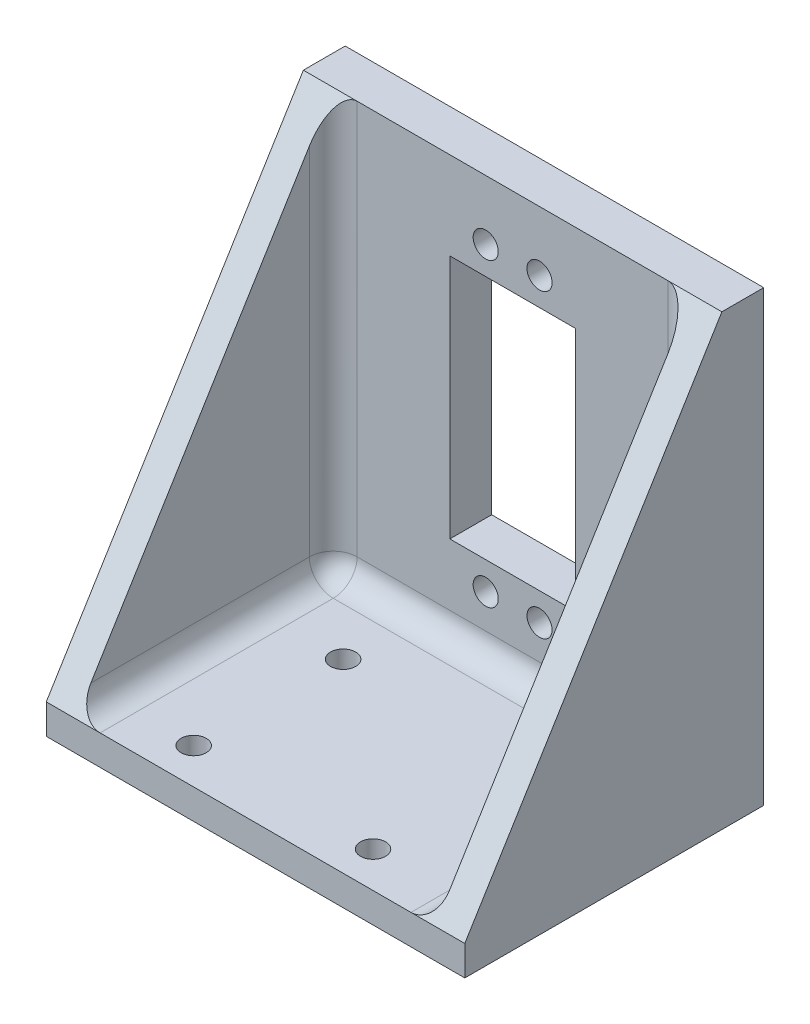
ISO-10303-21;
HEADER;
FILE_DESCRIPTION(('STEP AP214'),'2;1');
FILE_NAME('part.step','',(''),(''),'','','');
FILE_SCHEMA(('AUTOMOTIVE_DESIGN { 1 0 10303 214 1 1 1 1 }'));
ENDSEC;
DATA;
#1=APPLICATION_CONTEXT('core data for automotive mechanical design processes');
#2=APPLICATION_PROTOCOL_DEFINITION('international standard','automotive_design',2000,#1);
#3=PRODUCT_CONTEXT('',#1,'mechanical');
#4=PRODUCT('Part','Part','',(#3));
#5=PRODUCT_RELATED_PRODUCT_CATEGORY('part','',(#4));
#6=PRODUCT_DEFINITION_FORMATION('','',#4);
#7=PRODUCT_DEFINITION_CONTEXT('part definition',#1,'design');
#8=PRODUCT_DEFINITION('design','',#6,#7);
#9=PRODUCT_DEFINITION_SHAPE('','',#8);
#10=(LENGTH_UNIT() NAMED_UNIT(*) SI_UNIT(.MILLI.,.METRE.));
#11=(NAMED_UNIT(*) PLANE_ANGLE_UNIT() SI_UNIT($,.RADIAN.));
#12=(NAMED_UNIT(*) SI_UNIT($,.STERADIAN.) SOLID_ANGLE_UNIT());
#13=UNCERTAINTY_MEASURE_WITH_UNIT(LENGTH_MEASURE(1.E-05),#10,'distance_accuracy_value','');
#14=(GEOMETRIC_REPRESENTATION_CONTEXT(3) GLOBAL_UNCERTAINTY_ASSIGNED_CONTEXT((#13)) GLOBAL_UNIT_ASSIGNED_CONTEXT((#10,
#11,#12)) REPRESENTATION_CONTEXT('',''));
#15=CARTESIAN_POINT('',(0.,0.,0.));
#16=DIRECTION('',(0.,0.,1.));
#17=DIRECTION('',(1.,0.,0.));
#18=AXIS2_PLACEMENT_3D('',#15,#16,#17);
#19=CARTESIAN_POINT('',(0.,5.,0.));
#20=DIRECTION('',(0.,-1.,0.));
#21=DIRECTION('',(0.,0.,-1.));
#22=AXIS2_PLACEMENT_3D('',#19,#20,#21);
#23=PLANE('',#22);
#24=CARTESIAN_POINT('',(13.6520372940353,5.,-6.));
#25=DIRECTION('',(0.,1.,0.));
#26=DIRECTION('',(0.,0.,1.));
#27=AXIS2_PLACEMENT_3D('',#24,#25,#26);
#28=CIRCLE('',#27,2.1);
#29=CARTESIAN_POINT('',(13.6520372940353,5.,-3.9));
#30=VERTEX_POINT('',#29);
#31=EDGE_CURVE('E534',#30,#30,#28,.T.);
#32=ORIENTED_EDGE('',*,*,#31,.F.);
#33=EDGE_LOOP('',(#32));
#34=FACE_BOUND('',#33,.T.);
#35=CARTESIAN_POINT('',(-16.3479627059647,5.,19.));
#36=DIRECTION('',(0.,1.,0.));
#37=DIRECTION('',(0.,0.,1.));
#38=AXIS2_PLACEMENT_3D('',#35,#36,#37);
#39=CIRCLE('',#38,2.1);
#40=CARTESIAN_POINT('',(-16.3479627059647,5.,21.1));
#41=VERTEX_POINT('',#40);
#42=EDGE_CURVE('E530',#41,#41,#39,.T.);
#43=ORIENTED_EDGE('',*,*,#42,.F.);
#44=EDGE_LOOP('',(#43));
#45=FACE_BOUND('',#44,.T.);
#46=CARTESIAN_POINT('',(13.6520372940353,5.,19.));
#47=DIRECTION('',(0.,1.,0.));
#48=DIRECTION('',(0.,0.,1.));
#49=AXIS2_PLACEMENT_3D('',#46,#47,#48);
#50=CIRCLE('',#49,2.1);
#51=CARTESIAN_POINT('',(13.6520372940353,5.,21.1));
#52=VERTEX_POINT('',#51);
#53=EDGE_CURVE('E522',#52,#52,#50,.T.);
#54=ORIENTED_EDGE('',*,*,#53,.F.);
#55=EDGE_LOOP('',(#54));
#56=FACE_BOUND('',#55,.T.);
#57=CARTESIAN_POINT('',(-16.3479627059647,5.,-6.));
#58=DIRECTION('',(0.,1.,0.));
#59=DIRECTION('',(0.,0.,1.));
#60=AXIS2_PLACEMENT_3D('',#57,#58,#59);
#61=CIRCLE('',#60,2.1);
#62=CARTESIAN_POINT('',(-16.3479627059647,5.,-3.9));
#63=VERTEX_POINT('',#62);
#64=EDGE_CURVE('E325',#63,#63,#61,.T.);
#65=ORIENTED_EDGE('',*,*,#64,.F.);
#66=EDGE_LOOP('',(#65));
#67=FACE_BOUND('',#66,.T.);
#68=DIRECTION('',(1.,0.,0.));
#69=VECTOR('',#68,1.);
#70=CARTESIAN_POINT('',(-30.,5.,-14.));
#71=LINE('',#70,#69);
#72=CARTESIAN_POINT('',(26.,5.,-14.));
#73=VERTEX_POINT('',#72);
#74=CARTESIAN_POINT('',(-26.,5.,-14.));
#75=VERTEX_POINT('',#74);
#76=EDGE_CURVE('E248',#73,#75,#71,.F.);
#77=ORIENTED_EDGE('',*,*,#76,.T.);
#78=DIRECTION('',(0.,0.,1.));
#79=VECTOR('',#78,1.);
#80=CARTESIAN_POINT('',(-26.,5.,25.));
#81=LINE('',#80,#79);
#82=CARTESIAN_POINT('',(-26.,5.,25.));
#83=VERTEX_POINT('',#82);
#84=EDGE_CURVE('E256',#75,#83,#81,.T.);
#85=ORIENTED_EDGE('',*,*,#84,.T.);
#86=DIRECTION('',(1.,0.,0.));
#87=VECTOR('',#86,1.);
#88=CARTESIAN_POINT('',(-35.,5.,25.));
#89=LINE('',#88,#87);
#90=CARTESIAN_POINT('',(26.,5.,25.));
#91=VERTEX_POINT('',#90);
#92=EDGE_CURVE('E198',#83,#91,#89,.T.);
#93=ORIENTED_EDGE('',*,*,#92,.T.);
#94=DIRECTION('',(0.,0.,-1.));
#95=VECTOR('',#94,1.);
#96=CARTESIAN_POINT('',(26.,5.,0.));
#97=LINE('',#96,#95);
#98=EDGE_CURVE('E252',#91,#73,#97,.T.);
#99=ORIENTED_EDGE('',*,*,#98,.T.);
#100=EDGE_LOOP('',(#77,#85,#93,#99));
#101=FACE_BOUND('',#100,.T.);
#102=ADVANCED_FACE('F45',(#34,#45,#56,#67,#101),#23,.F.);
#103=CARTESIAN_POINT('',(-35.,75.,-18.));
#104=DIRECTION('',(0.,0.,-1.));
#105=DIRECTION('',(-1.,0.,0.));
#106=AXIS2_PLACEMENT_3D('',#103,#104,#105);
#107=PLANE('',#106);
#108=CARTESIAN_POINT('',(4.5,65.,-18.));
#109=DIRECTION('',(0.,0.,-1.));
#110=DIRECTION('',(-1.,0.,0.));
#111=AXIS2_PLACEMENT_3D('',#108,#109,#110);
#112=CIRCLE('',#111,2.10000000000001);
#113=CARTESIAN_POINT('',(2.4,65.,-18.));
#114=VERTEX_POINT('',#113);
#115=EDGE_CURVE('E211',#114,#114,#112,.T.);
#116=ORIENTED_EDGE('',*,*,#115,.T.);
#117=EDGE_LOOP('',(#116));
#118=FACE_BOUND('',#117,.T.);
#119=CARTESIAN_POINT('',(-4.50000000000001,65.,-18.));
#120=DIRECTION('',(0.,0.,-1.));
#121=DIRECTION('',(-1.,0.,0.));
#122=AXIS2_PLACEMENT_3D('',#119,#120,#121);
#123=CIRCLE('',#122,2.10000000000001);
#124=CARTESIAN_POINT('',(-6.60000000000001,65.,-18.));
#125=VERTEX_POINT('',#124);
#126=EDGE_CURVE('E215',#125,#125,#123,.T.);
#127=ORIENTED_EDGE('',*,*,#126,.T.);
#128=EDGE_LOOP('',(#127));
#129=FACE_BOUND('',#128,.T.);
#130=DIRECTION('',(0.,-1.,0.));
#131=VECTOR('',#130,1.);
#132=CARTESIAN_POINT('',(10.5,75.,-18.));
#133=LINE('',#132,#131);
#134=CARTESIAN_POINT('',(10.5,60.35,-18.));
#135=VERTEX_POINT('',#134);
#136=CARTESIAN_POINT('',(10.5,19.35,-18.));
#137=VERTEX_POINT('',#136);
#138=EDGE_CURVE('E228',#135,#137,#133,.T.);
#139=ORIENTED_EDGE('',*,*,#138,.T.);
#140=DIRECTION('',(-1.,0.,0.));
#141=VECTOR('',#140,1.);
#142=CARTESIAN_POINT('',(-35.,19.35,-18.));
#143=LINE('',#142,#141);
#144=CARTESIAN_POINT('',(-10.5,19.35,-18.));
#145=VERTEX_POINT('',#144);
#146=EDGE_CURVE('E232',#137,#145,#143,.T.);
#147=ORIENTED_EDGE('',*,*,#146,.T.);
#148=DIRECTION('',(0.,1.,0.));
#149=VECTOR('',#148,1.);
#150=CARTESIAN_POINT('',(-10.5,75.,-18.));
#151=LINE('',#150,#149);
#152=CARTESIAN_POINT('',(-10.5,60.35,-18.));
#153=VERTEX_POINT('',#152);
#154=EDGE_CURVE('E210',#145,#153,#151,.T.);
#155=ORIENTED_EDGE('',*,*,#154,.T.);
#156=DIRECTION('',(1.,0.,0.));
#157=VECTOR('',#156,1.);
#158=CARTESIAN_POINT('',(-35.,60.35,-18.));
#159=LINE('',#158,#157);
#160=EDGE_CURVE('E224',#153,#135,#159,.T.);
#161=ORIENTED_EDGE('',*,*,#160,.T.);
#162=EDGE_LOOP('',(#139,#147,#155,#161));
#163=FACE_BOUND('',#162,.T.);
#164=CARTESIAN_POINT('',(-4.50000000000001,14.7,-18.));
#165=DIRECTION('',(0.,0.,-1.));
#166=DIRECTION('',(-1.,0.,0.));
#167=AXIS2_PLACEMENT_3D('',#164,#165,#166);
#168=CIRCLE('',#167,2.1);
#169=CARTESIAN_POINT('',(-6.60000000000001,14.7,-18.));
#170=VERTEX_POINT('',#169);
#171=EDGE_CURVE('E220',#170,#170,#168,.T.);
#172=ORIENTED_EDGE('',*,*,#171,.T.);
#173=EDGE_LOOP('',(#172));
#174=FACE_BOUND('',#173,.T.);
#175=CARTESIAN_POINT('',(4.5,14.7,-18.));
#176=DIRECTION('',(0.,0.,-1.));
#177=DIRECTION('',(-1.,0.,0.));
#178=AXIS2_PLACEMENT_3D('',#175,#176,#177);
#179=CIRCLE('',#178,2.1);
#180=CARTESIAN_POINT('',(2.4,14.7,-18.));
#181=VERTEX_POINT('',#180);
#182=EDGE_CURVE('E240',#181,#181,#179,.T.);
#183=ORIENTED_EDGE('',*,*,#182,.T.);
#184=EDGE_LOOP('',(#183));
#185=FACE_BOUND('',#184,.T.);
#186=DIRECTION('',(1.,0.,0.));
#187=VECTOR('',#186,1.);
#188=CARTESIAN_POINT('',(-35.,75.,-18.));
#189=LINE('',#188,#187);
#190=CARTESIAN_POINT('',(-26.,75.,-18.));
#191=VERTEX_POINT('',#190);
#192=CARTESIAN_POINT('',(26.,75.,-18.));
#193=VERTEX_POINT('',#192);
#194=EDGE_CURVE('E380',#191,#193,#189,.T.);
#195=ORIENTED_EDGE('',*,*,#194,.F.);
#196=DIRECTION('',(0.,-1.,0.));
#197=VECTOR('',#196,1.);
#198=CARTESIAN_POINT('',(-26.,9.00000000000001,-18.));
#199=LINE('',#198,#197);
#200=CARTESIAN_POINT('',(-26.,9.00000000000001,-18.));
#201=VERTEX_POINT('',#200);
#202=EDGE_CURVE('E282',#191,#201,#199,.T.);
#203=ORIENTED_EDGE('',*,*,#202,.T.);
#204=DIRECTION('',(1.,0.,0.));
#205=VECTOR('',#204,1.);
#206=CARTESIAN_POINT('',(30.,9.00000000000001,-18.));
#207=LINE('',#206,#205);
#208=CARTESIAN_POINT('',(26.,9.00000000000001,-18.));
#209=VERTEX_POINT('',#208);
#210=EDGE_CURVE('E236',#201,#209,#207,.T.);
#211=ORIENTED_EDGE('',*,*,#210,.T.);
#212=DIRECTION('',(0.,1.,0.));
#213=VECTOR('',#212,1.);
#214=CARTESIAN_POINT('',(26.,75.,-18.));
#215=LINE('',#214,#213);
#216=EDGE_CURVE('E278',#209,#193,#215,.T.);
#217=ORIENTED_EDGE('',*,*,#216,.T.);
#218=EDGE_LOOP('',(#195,#203,#211,#217));
#219=FACE_BOUND('',#218,.T.);
#220=ADVANCED_FACE('F428',(#118,#129,#163,#174,#185,#219),#107,.F.);
#221=CARTESIAN_POINT('',(35.,5.,25.));
#222=DIRECTION('',(-1.,0.,0.));
#223=DIRECTION('',(0.,0.,1.));
#224=AXIS2_PLACEMENT_3D('',#221,#222,#223);
#225=PLANE('',#224);
#226=DIRECTION('',(0.,0.,-1.));
#227=VECTOR('',#226,1.);
#228=CARTESIAN_POINT('',(35.,0.,25.));
#229=LINE('',#228,#227);
#230=CARTESIAN_POINT('',(35.,0.,25.));
#231=VERTEX_POINT('',#230);
#232=CARTESIAN_POINT('',(35.,0.,-25.));
#233=VERTEX_POINT('',#232);
#234=EDGE_CURVE('E388',#231,#233,#229,.T.);
#235=ORIENTED_EDGE('',*,*,#234,.T.);
#236=DIRECTION('',(0.,-1.,0.));
#237=VECTOR('',#236,1.);
#238=CARTESIAN_POINT('',(35.,5.,-25.));
#239=LINE('',#238,#237);
#240=CARTESIAN_POINT('',(35.,75.,-25.));
#241=VERTEX_POINT('',#240);
#242=EDGE_CURVE('E206',#241,#233,#239,.T.);
#243=ORIENTED_EDGE('',*,*,#242,.F.);
#244=DIRECTION('',(0.,0.,-1.));
#245=VECTOR('',#244,1.);
#246=CARTESIAN_POINT('',(35.,75.,-25.));
#247=LINE('',#246,#245);
#248=CARTESIAN_POINT('',(35.,75.,-18.));
#249=VERTEX_POINT('',#248);
#250=EDGE_CURVE('E181',#249,#241,#247,.T.);
#251=ORIENTED_EDGE('',*,*,#250,.F.);
#252=DIRECTION('',(0.,-0.852075986307815,0.523418105874801));
#253=VECTOR('',#252,1.);
#254=CARTESIAN_POINT('',(35.,75.,-18.));
#255=LINE('',#254,#253);
#256=CARTESIAN_POINT('',(35.,5.,25.));
#257=VERTEX_POINT('',#256);
#258=EDGE_CURVE('E159',#249,#257,#255,.T.);
#259=ORIENTED_EDGE('',*,*,#258,.T.);
#260=DIRECTION('',(0.,-1.,0.));
#261=VECTOR('',#260,1.);
#262=CARTESIAN_POINT('',(35.,5.,25.));
#263=LINE('',#262,#261);
#264=EDGE_CURVE('E178',#257,#231,#263,.T.);
#265=ORIENTED_EDGE('',*,*,#264,.T.);
#266=EDGE_LOOP('',(#235,#243,#251,#259,#265));
#267=FACE_BOUND('',#266,.T.);
#268=ADVANCED_FACE('F177',(#267),#225,.F.);
#269=CARTESIAN_POINT('',(-35.,5.,-25.));
#270=DIRECTION('',(0.,0.,1.));
#271=DIRECTION('',(1.,0.,0.));
#272=AXIS2_PLACEMENT_3D('',#269,#270,#271);
#273=PLANE('',#272);
#274=CARTESIAN_POINT('',(4.5,14.7,-25.));
#275=DIRECTION('',(0.,0.,-1.));
#276=DIRECTION('',(1.,0.,0.));
#277=AXIS2_PLACEMENT_3D('',#274,#275,#276);
#278=CIRCLE('',#277,2.1);
#279=CARTESIAN_POINT('',(6.60000000000001,14.7,-25.));
#280=VERTEX_POINT('',#279);
#281=EDGE_CURVE('E332',#280,#280,#278,.T.);
#282=ORIENTED_EDGE('',*,*,#281,.F.);
#283=EDGE_LOOP('',(#282));
#284=FACE_BOUND('',#283,.T.);
#285=CARTESIAN_POINT('',(-4.50000000000001,14.7,-25.));
#286=DIRECTION('',(0.,0.,-1.));
#287=DIRECTION('',(-1.,0.,0.));
#288=AXIS2_PLACEMENT_3D('',#285,#286,#287);
#289=CIRCLE('',#288,2.1);
#290=CARTESIAN_POINT('',(-6.60000000000001,14.7,-25.));
#291=VERTEX_POINT('',#290);
#292=EDGE_CURVE('E355',#291,#291,#289,.T.);
#293=ORIENTED_EDGE('',*,*,#292,.F.);
#294=EDGE_LOOP('',(#293));
#295=FACE_BOUND('',#294,.T.);
#296=DIRECTION('',(0.,1.,0.));
#297=VECTOR('',#296,1.);
#298=CARTESIAN_POINT('',(-10.5,19.35,-25.));
#299=LINE('',#298,#297);
#300=CARTESIAN_POINT('',(-10.5,19.35,-25.));
#301=VERTEX_POINT('',#300);
#302=CARTESIAN_POINT('',(-10.5,60.35,-25.));
#303=VERTEX_POINT('',#302);
#304=EDGE_CURVE('E363',#301,#303,#299,.T.);
#305=ORIENTED_EDGE('',*,*,#304,.F.);
#306=DIRECTION('',(-1.,0.,0.));
#307=VECTOR('',#306,1.);
#308=CARTESIAN_POINT('',(10.5,19.35,-25.));
#309=LINE('',#308,#307);
#310=CARTESIAN_POINT('',(10.5,19.35,-25.));
#311=VERTEX_POINT('',#310);
#312=EDGE_CURVE('E340',#311,#301,#309,.T.);
#313=ORIENTED_EDGE('',*,*,#312,.F.);
#314=DIRECTION('',(0.,-1.,0.));
#315=VECTOR('',#314,1.);
#316=CARTESIAN_POINT('',(10.5,19.35,-25.));
#317=LINE('',#316,#315);
#318=CARTESIAN_POINT('',(10.5,60.35,-25.));
#319=VERTEX_POINT('',#318);
#320=EDGE_CURVE('E345',#319,#311,#317,.T.);
#321=ORIENTED_EDGE('',*,*,#320,.F.);
#322=DIRECTION('',(1.,0.,0.));
#323=VECTOR('',#322,1.);
#324=CARTESIAN_POINT('',(10.5,60.35,-25.));
#325=LINE('',#324,#323);
#326=EDGE_CURVE('E359',#303,#319,#325,.T.);
#327=ORIENTED_EDGE('',*,*,#326,.F.);
#328=EDGE_LOOP('',(#305,#313,#321,#327));
#329=FACE_BOUND('',#328,.T.);
#330=CARTESIAN_POINT('',(-4.50000000000001,65.,-25.));
#331=DIRECTION('',(0.,0.,-1.));
#332=DIRECTION('',(1.,0.,0.));
#333=AXIS2_PLACEMENT_3D('',#330,#331,#332);
#334=CIRCLE('',#333,2.10000000000001);
#335=CARTESIAN_POINT('',(-2.4,65.,-25.));
#336=VERTEX_POINT('',#335);
#337=EDGE_CURVE('E336',#336,#336,#334,.T.);
#338=ORIENTED_EDGE('',*,*,#337,.F.);
#339=EDGE_LOOP('',(#338));
#340=FACE_BOUND('',#339,.T.);
#341=CARTESIAN_POINT('',(4.5,65.,-25.));
#342=DIRECTION('',(0.,0.,-1.));
#343=DIRECTION('',(-1.,0.,0.));
#344=AXIS2_PLACEMENT_3D('',#341,#342,#343);
#345=CIRCLE('',#344,2.10000000000001);
#346=CARTESIAN_POINT('',(2.4,65.,-25.));
#347=VERTEX_POINT('',#346);
#348=EDGE_CURVE('E216',#347,#347,#345,.T.);
#349=ORIENTED_EDGE('',*,*,#348,.F.);
#350=EDGE_LOOP('',(#349));
#351=FACE_BOUND('',#350,.T.);
#352=DIRECTION('',(-1.,0.,0.));
#353=VECTOR('',#352,1.);
#354=CARTESIAN_POINT('',(-35.,0.,-25.));
#355=LINE('',#354,#353);
#356=CARTESIAN_POINT('',(-35.,0.,-25.));
#357=VERTEX_POINT('',#356);
#358=EDGE_CURVE('E392',#233,#357,#355,.T.);
#359=ORIENTED_EDGE('',*,*,#358,.T.);
#360=DIRECTION('',(0.,-1.,0.));
#361=VECTOR('',#360,1.);
#362=CARTESIAN_POINT('',(-35.,5.,-25.));
#363=LINE('',#362,#361);
#364=CARTESIAN_POINT('',(-35.,75.,-25.));
#365=VERTEX_POINT('',#364);
#366=EDGE_CURVE('E196',#365,#357,#363,.T.);
#367=ORIENTED_EDGE('',*,*,#366,.F.);
#368=DIRECTION('',(-1.,0.,0.));
#369=VECTOR('',#368,1.);
#370=CARTESIAN_POINT('',(-35.,75.,-25.));
#371=LINE('',#370,#369);
#372=EDGE_CURVE('E385',#241,#365,#371,.T.);
#373=ORIENTED_EDGE('',*,*,#372,.F.);
#374=ORIENTED_EDGE('',*,*,#242,.T.);
#375=EDGE_LOOP('',(#359,#367,#373,#374));
#376=FACE_BOUND('',#375,.T.);
#377=ADVANCED_FACE('F435',(#284,#295,#329,#340,#351,#376),#273,.F.);
#378=CARTESIAN_POINT('',(-35.,5.,25.));
#379=DIRECTION('',(1.,0.,0.));
#380=DIRECTION('',(0.,0.,-1.));
#381=AXIS2_PLACEMENT_3D('',#378,#379,#380);
#382=PLANE('',#381);
#383=DIRECTION('',(0.,-1.,0.));
#384=VECTOR('',#383,1.);
#385=CARTESIAN_POINT('',(-35.,5.,25.));
#386=LINE('',#385,#384);
#387=CARTESIAN_POINT('',(-35.,5.,25.));
#388=VERTEX_POINT('',#387);
#389=CARTESIAN_POINT('',(-35.,0.,25.));
#390=VERTEX_POINT('',#389);
#391=EDGE_CURVE('E191',#388,#390,#386,.T.);
#392=ORIENTED_EDGE('',*,*,#391,.F.);
#393=DIRECTION('',(0.,0.852075986307815,-0.523418105874801));
#394=VECTOR('',#393,1.);
#395=CARTESIAN_POINT('',(-35.,75.,-18.));
#396=LINE('',#395,#394);
#397=CARTESIAN_POINT('',(-35.,75.,-18.));
#398=VERTEX_POINT('',#397);
#399=EDGE_CURVE('E170',#388,#398,#396,.T.);
#400=ORIENTED_EDGE('',*,*,#399,.T.);
#401=DIRECTION('',(0.,0.,1.));
#402=VECTOR('',#401,1.);
#403=CARTESIAN_POINT('',(-35.,75.,-25.));
#404=LINE('',#403,#402);
#405=EDGE_CURVE('E244',#365,#398,#404,.T.);
#406=ORIENTED_EDGE('',*,*,#405,.F.);
#407=ORIENTED_EDGE('',*,*,#366,.T.);
#408=DIRECTION('',(0.,0.,1.));
#409=VECTOR('',#408,1.);
#410=CARTESIAN_POINT('',(-35.,0.,25.));
#411=LINE('',#410,#409);
#412=EDGE_CURVE('E394',#357,#390,#411,.T.);
#413=ORIENTED_EDGE('',*,*,#412,.T.);
#414=EDGE_LOOP('',(#392,#400,#406,#407,#413));
#415=FACE_BOUND('',#414,.T.);
#416=ADVANCED_FACE('F431',(#415),#382,.F.);
#417=CARTESIAN_POINT('',(-35.,5.,25.));
#418=DIRECTION('',(0.,0.,-1.));
#419=DIRECTION('',(-1.,0.,0.));
#420=AXIS2_PLACEMENT_3D('',#417,#418,#419);
#421=PLANE('',#420);
#422=DIRECTION('',(1.,0.,0.));
#423=VECTOR('',#422,1.);
#424=CARTESIAN_POINT('',(-35.,0.,25.));
#425=LINE('',#424,#423);
#426=EDGE_CURVE('E189',#390,#231,#425,.T.);
#427=ORIENTED_EDGE('',*,*,#426,.T.);
#428=ORIENTED_EDGE('',*,*,#264,.F.);
#429=DIRECTION('',(1.,0.,0.));
#430=VECTOR('',#429,1.);
#431=CARTESIAN_POINT('',(30.,5.,25.));
#432=LINE('',#431,#430);
#433=EDGE_CURVE('E155',#91,#257,#432,.T.);
#434=ORIENTED_EDGE('',*,*,#433,.F.);
#435=ORIENTED_EDGE('',*,*,#92,.F.);
#436=EDGE_CURVE('E192',#388,#83,#89,.T.);
#437=ORIENTED_EDGE('',*,*,#436,.F.);
#438=ORIENTED_EDGE('',*,*,#391,.T.);
#439=EDGE_LOOP('',(#427,#428,#434,#435,#437,#438));
#440=FACE_BOUND('',#439,.T.);
#441=ADVANCED_FACE('F186',(#440),#421,.F.);
#442=CARTESIAN_POINT('',(0.,0.,0.));
#443=DIRECTION('',(0.,-1.,0.));
#444=DIRECTION('',(0.,0.,-1.));
#445=AXIS2_PLACEMENT_3D('',#442,#443,#444);
#446=PLANE('',#445);
#447=CARTESIAN_POINT('',(13.6520372940353,0.,-6.));
#448=DIRECTION('',(0.,1.,0.));
#449=DIRECTION('',(0.,0.,1.));
#450=AXIS2_PLACEMENT_3D('',#447,#448,#449);
#451=CIRCLE('',#450,2.1);
#452=CARTESIAN_POINT('',(13.6520372940353,0.,-3.9));
#453=VERTEX_POINT('',#452);
#454=EDGE_CURVE('E538',#453,#453,#451,.T.);
#455=ORIENTED_EDGE('',*,*,#454,.T.);
#456=EDGE_LOOP('',(#455));
#457=FACE_BOUND('',#456,.T.);
#458=CARTESIAN_POINT('',(-16.3479627059647,0.,19.));
#459=DIRECTION('',(0.,1.,0.));
#460=DIRECTION('',(0.,0.,1.));
#461=AXIS2_PLACEMENT_3D('',#458,#459,#460);
#462=CIRCLE('',#461,2.1);
#463=CARTESIAN_POINT('',(-16.3479627059647,0.,21.1));
#464=VERTEX_POINT('',#463);
#465=EDGE_CURVE('E525',#464,#464,#462,.T.);
#466=ORIENTED_EDGE('',*,*,#465,.T.);
#467=EDGE_LOOP('',(#466));
#468=FACE_BOUND('',#467,.T.);
#469=CARTESIAN_POINT('',(13.6520372940353,0.,19.));
#470=DIRECTION('',(0.,1.,0.));
#471=DIRECTION('',(0.,0.,1.));
#472=AXIS2_PLACEMENT_3D('',#469,#470,#471);
#473=CIRCLE('',#472,2.1);
#474=CARTESIAN_POINT('',(13.6520372940353,0.,21.1));
#475=VERTEX_POINT('',#474);
#476=EDGE_CURVE('E300',#475,#475,#473,.T.);
#477=ORIENTED_EDGE('',*,*,#476,.T.);
#478=EDGE_LOOP('',(#477));
#479=FACE_BOUND('',#478,.T.);
#480=CARTESIAN_POINT('',(-16.3479627059647,0.,-6.));
#481=DIRECTION('',(0.,1.,0.));
#482=DIRECTION('',(0.,0.,1.));
#483=AXIS2_PLACEMENT_3D('',#480,#481,#482);
#484=CIRCLE('',#483,2.1);
#485=CARTESIAN_POINT('',(-16.3479627059647,0.,-3.9));
#486=VERTEX_POINT('',#485);
#487=EDGE_CURVE('E184',#486,#486,#484,.T.);
#488=ORIENTED_EDGE('',*,*,#487,.T.);
#489=EDGE_LOOP('',(#488));
#490=FACE_BOUND('',#489,.T.);
#491=ORIENTED_EDGE('',*,*,#234,.F.);
#492=ORIENTED_EDGE('',*,*,#426,.F.);
#493=ORIENTED_EDGE('',*,*,#412,.F.);
#494=ORIENTED_EDGE('',*,*,#358,.F.);
#495=EDGE_LOOP('',(#491,#492,#493,#494));
#496=FACE_BOUND('',#495,.T.);
#497=ADVANCED_FACE('F437',(#457,#468,#479,#490,#496),#446,.T.);
#498=CARTESIAN_POINT('',(0.,75.,0.));
#499=DIRECTION('',(0.,1.,0.));
#500=DIRECTION('',(0.,0.,1.));
#501=AXIS2_PLACEMENT_3D('',#498,#499,#500);
#502=PLANE('',#501);
#503=ORIENTED_EDGE('',*,*,#405,.T.);
#504=EDGE_CURVE('E64',#398,#191,#189,.T.);
#505=ORIENTED_EDGE('',*,*,#504,.T.);
#506=ORIENTED_EDGE('',*,*,#194,.T.);
#507=DIRECTION('',(1.,0.,0.));
#508=VECTOR('',#507,1.);
#509=CARTESIAN_POINT('',(30.,75.,-18.));
#510=LINE('',#509,#508);
#511=EDGE_CURVE('E171',#193,#249,#510,.T.);
#512=ORIENTED_EDGE('',*,*,#511,.T.);
#513=ORIENTED_EDGE('',*,*,#250,.T.);
#514=ORIENTED_EDGE('',*,*,#372,.T.);
#515=EDGE_LOOP('',(#503,#505,#506,#512,#513,#514));
#516=FACE_BOUND('',#515,.T.);
#517=ADVANCED_FACE('F432',(#516),#502,.T.);
#518=CARTESIAN_POINT('',(4.5,65.,45.));
#519=DIRECTION('',(0.,0.,-1.));
#520=DIRECTION('',(-1.,0.,0.));
#521=AXIS2_PLACEMENT_3D('',#518,#519,#520);
#522=CYLINDRICAL_SURFACE('',#521,2.10000000000001);
#523=ORIENTED_EDGE('',*,*,#348,.T.);
#524=EDGE_LOOP('',(#523));
#525=FACE_BOUND('',#524,.T.);
#526=ORIENTED_EDGE('',*,*,#115,.F.);
#527=EDGE_LOOP('',(#526));
#528=FACE_BOUND('',#527,.T.);
#529=ADVANCED_FACE('F445',(#525,#528),#522,.F.);
#530=CARTESIAN_POINT('',(-4.50000000000001,65.,45.));
#531=DIRECTION('',(0.,0.,-1.));
#532=DIRECTION('',(-1.,0.,0.));
#533=AXIS2_PLACEMENT_3D('',#530,#531,#532);
#534=CYLINDRICAL_SURFACE('',#533,2.10000000000001);
#535=ORIENTED_EDGE('',*,*,#337,.T.);
#536=EDGE_LOOP('',(#535));
#537=FACE_BOUND('',#536,.T.);
#538=ORIENTED_EDGE('',*,*,#126,.F.);
#539=EDGE_LOOP('',(#538));
#540=FACE_BOUND('',#539,.T.);
#541=ADVANCED_FACE('F463',(#537,#540),#534,.F.);
#542=CARTESIAN_POINT('',(10.5,19.35,45.));
#543=DIRECTION('',(0.,-1.,0.));
#544=DIRECTION('',(1.,0.,0.));
#545=AXIS2_PLACEMENT_3D('',#542,#543,#544);
#546=PLANE('',#545);
#547=DIRECTION('',(0.,0.,-1.));
#548=VECTOR('',#547,1.);
#549=CARTESIAN_POINT('',(10.5,19.35,45.));
#550=LINE('',#549,#548);
#551=EDGE_CURVE('E352',#137,#311,#550,.T.);
#552=ORIENTED_EDGE('',*,*,#551,.T.);
#553=ORIENTED_EDGE('',*,*,#312,.T.);
#554=DIRECTION('',(0.,0.,-1.));
#555=VECTOR('',#554,1.);
#556=CARTESIAN_POINT('',(-10.5,19.35,45.));
#557=LINE('',#556,#555);
#558=EDGE_CURVE('E341',#145,#301,#557,.T.);
#559=ORIENTED_EDGE('',*,*,#558,.F.);
#560=ORIENTED_EDGE('',*,*,#146,.F.);
#561=EDGE_LOOP('',(#552,#553,#559,#560));
#562=FACE_BOUND('',#561,.T.);
#563=ADVANCED_FACE('F478',(#562),#546,.F.);
#564=CARTESIAN_POINT('',(10.5,19.35,45.));
#565=DIRECTION('',(1.,0.,0.));
#566=DIRECTION('',(0.,1.,0.));
#567=AXIS2_PLACEMENT_3D('',#564,#565,#566);
#568=PLANE('',#567);
#569=DIRECTION('',(0.,0.,-1.));
#570=VECTOR('',#569,1.);
#571=CARTESIAN_POINT('',(10.5,60.35,45.));
#572=LINE('',#571,#570);
#573=EDGE_CURVE('E349',#135,#319,#572,.T.);
#574=ORIENTED_EDGE('',*,*,#573,.T.);
#575=ORIENTED_EDGE('',*,*,#320,.T.);
#576=ORIENTED_EDGE('',*,*,#551,.F.);
#577=ORIENTED_EDGE('',*,*,#138,.F.);
#578=EDGE_LOOP('',(#574,#575,#576,#577));
#579=FACE_BOUND('',#578,.T.);
#580=ADVANCED_FACE('F474',(#579),#568,.F.);
#581=CARTESIAN_POINT('',(10.5,60.35,45.));
#582=DIRECTION('',(0.,1.,0.));
#583=DIRECTION('',(-1.,0.,0.));
#584=AXIS2_PLACEMENT_3D('',#581,#582,#583);
#585=PLANE('',#584);
#586=DIRECTION('',(0.,0.,-1.));
#587=VECTOR('',#586,1.);
#588=CARTESIAN_POINT('',(-10.5,60.35,45.));
#589=LINE('',#588,#587);
#590=EDGE_CURVE('E346',#153,#303,#589,.T.);
#591=ORIENTED_EDGE('',*,*,#590,.T.);
#592=ORIENTED_EDGE('',*,*,#326,.T.);
#593=ORIENTED_EDGE('',*,*,#573,.F.);
#594=ORIENTED_EDGE('',*,*,#160,.F.);
#595=EDGE_LOOP('',(#591,#592,#593,#594));
#596=FACE_BOUND('',#595,.T.);
#597=ADVANCED_FACE('F477',(#596),#585,.F.);
#598=CARTESIAN_POINT('',(-10.5,19.35,45.));
#599=DIRECTION('',(-1.,0.,0.));
#600=DIRECTION('',(0.,-1.,0.));
#601=AXIS2_PLACEMENT_3D('',#598,#599,#600);
#602=PLANE('',#601);
#603=ORIENTED_EDGE('',*,*,#558,.T.);
#604=ORIENTED_EDGE('',*,*,#304,.T.);
#605=ORIENTED_EDGE('',*,*,#590,.F.);
#606=ORIENTED_EDGE('',*,*,#154,.F.);
#607=EDGE_LOOP('',(#603,#604,#605,#606));
#608=FACE_BOUND('',#607,.T.);
#609=ADVANCED_FACE('F472',(#608),#602,.F.);
#610=CARTESIAN_POINT('',(-4.50000000000001,14.7,45.));
#611=DIRECTION('',(0.,0.,-1.));
#612=DIRECTION('',(-1.,0.,0.));
#613=AXIS2_PLACEMENT_3D('',#610,#611,#612);
#614=CYLINDRICAL_SURFACE('',#613,2.1);
#615=ORIENTED_EDGE('',*,*,#292,.T.);
#616=EDGE_LOOP('',(#615));
#617=FACE_BOUND('',#616,.T.);
#618=ORIENTED_EDGE('',*,*,#171,.F.);
#619=EDGE_LOOP('',(#618));
#620=FACE_BOUND('',#619,.T.);
#621=ADVANCED_FACE('F468',(#617,#620),#614,.F.);
#622=CARTESIAN_POINT('',(4.5,14.7,45.));
#623=DIRECTION('',(0.,0.,-1.));
#624=DIRECTION('',(-1.,0.,0.));
#625=AXIS2_PLACEMENT_3D('',#622,#623,#624);
#626=CYLINDRICAL_SURFACE('',#625,2.1);
#627=ORIENTED_EDGE('',*,*,#281,.T.);
#628=EDGE_LOOP('',(#627));
#629=FACE_BOUND('',#628,.T.);
#630=ORIENTED_EDGE('',*,*,#182,.F.);
#631=EDGE_LOOP('',(#630));
#632=FACE_BOUND('',#631,.T.);
#633=ADVANCED_FACE('F465',(#629,#632),#626,.F.);
#634=CARTESIAN_POINT('',(-30.,75.,-18.));
#635=DIRECTION('',(0.,0.523418105874801,0.852075986307815));
#636=DIRECTION('',(0.,-0.852075986307815,0.523418105874801));
#637=AXIS2_PLACEMENT_3D('',#634,#635,#636);
#638=PLANE('',#637);
#639=ORIENTED_EDGE('',*,*,#399,.F.);
#640=ORIENTED_EDGE('',*,*,#436,.T.);
#641=CARTESIAN_POINT('',(-26.,9.,22.5428571428571));
#642=DIRECTION('',(0.,0.523418105874801,0.852075986307815));
#643=DIRECTION('',(0.,0.852075986307815,-0.523418105874801));
#644=AXIS2_PLACEMENT_3D('',#641,#642,#643);
#645=ELLIPSE('',#644,4.69441700538077,4.);
#646=CARTESIAN_POINT('',(-30.,9.00000000000001,22.5428571428572));
#647=VERTEX_POINT('',#646);
#648=EDGE_CURVE('E285',#83,#647,#645,.F.);
#649=ORIENTED_EDGE('',*,*,#648,.T.);
#650=DIRECTION('',(0.,0.852075986307815,-0.523418105874801));
#651=VECTOR('',#650,1.);
#652=CARTESIAN_POINT('',(-30.,75.,-18.));
#653=LINE('',#652,#651);
#654=CARTESIAN_POINT('',(-30.,68.4883720930233,-14.));
#655=VERTEX_POINT('',#654);
#656=EDGE_CURVE('E328',#647,#655,#653,.T.);
#657=ORIENTED_EDGE('',*,*,#656,.T.);
#658=CARTESIAN_POINT('',(-26.,68.4883720930233,-14.));
#659=DIRECTION('',(0.,0.523418105874801,0.852075986307815));
#660=DIRECTION('',(0.,0.852075986307815,-0.523418105874801));
#661=AXIS2_PLACEMENT_3D('',#658,#659,#660);
#662=ELLIPSE('',#661,7.64207419480591,4.);
#663=EDGE_CURVE('E56',#655,#191,#662,.F.);
#664=ORIENTED_EDGE('',*,*,#663,.T.);
#665=ORIENTED_EDGE('',*,*,#504,.F.);
#666=EDGE_LOOP('',(#639,#640,#649,#657,#664,#665));
#667=FACE_BOUND('',#666,.T.);
#668=ADVANCED_FACE('F407',(#667),#638,.T.);
#669=CARTESIAN_POINT('',(-30.,0.,0.));
#670=DIRECTION('',(-1.,0.,0.));
#671=DIRECTION('',(0.,0.,1.));
#672=AXIS2_PLACEMENT_3D('',#669,#670,#671);
#673=PLANE('',#672);
#674=ORIENTED_EDGE('',*,*,#656,.F.);
#675=DIRECTION('',(0.,0.,1.));
#676=VECTOR('',#675,1.);
#677=CARTESIAN_POINT('',(-30.,9.,-14.));
#678=LINE('',#677,#676);
#679=CARTESIAN_POINT('',(-30.,9.00000000000001,-14.));
#680=VERTEX_POINT('',#679);
#681=EDGE_CURVE('E263',#647,#680,#678,.F.);
#682=ORIENTED_EDGE('',*,*,#681,.T.);
#683=DIRECTION('',(0.,-1.,0.));
#684=VECTOR('',#683,1.);
#685=CARTESIAN_POINT('',(-30.,75.,-14.));
#686=LINE('',#685,#684);
#687=EDGE_CURVE('E260',#680,#655,#686,.F.);
#688=ORIENTED_EDGE('',*,*,#687,.T.);
#689=EDGE_LOOP('',(#674,#682,#688));
#690=FACE_BOUND('',#689,.T.);
#691=ADVANCED_FACE('F415',(#690),#673,.F.);
#692=CARTESIAN_POINT('',(30.,75.,-18.));
#693=DIRECTION('',(0.,0.523418105874801,0.852075986307815));
#694=DIRECTION('',(0.,-0.852075986307815,0.523418105874801));
#695=AXIS2_PLACEMENT_3D('',#692,#693,#694);
#696=PLANE('',#695);
#697=ORIENTED_EDGE('',*,*,#258,.F.);
#698=ORIENTED_EDGE('',*,*,#511,.F.);
#699=CARTESIAN_POINT('',(26.,68.4883720930233,-14.));
#700=DIRECTION('',(0.,0.523418105874801,0.852075986307815));
#701=DIRECTION('',(0.,0.852075986307815,-0.523418105874801));
#702=AXIS2_PLACEMENT_3D('',#699,#700,#701);
#703=ELLIPSE('',#702,7.64207419480591,4.);
#704=CARTESIAN_POINT('',(30.,68.4883720930233,-14.));
#705=VERTEX_POINT('',#704);
#706=EDGE_CURVE('E11',#193,#705,#703,.F.);
#707=ORIENTED_EDGE('',*,*,#706,.T.);
#708=DIRECTION('',(0.,-0.852075986307815,0.523418105874801));
#709=VECTOR('',#708,1.);
#710=CARTESIAN_POINT('',(30.,75.,-18.));
#711=LINE('',#710,#709);
#712=CARTESIAN_POINT('',(30.,9.00000000000001,22.5428571428572));
#713=VERTEX_POINT('',#712);
#714=EDGE_CURVE('E183',#705,#713,#711,.T.);
#715=ORIENTED_EDGE('',*,*,#714,.T.);
#716=CARTESIAN_POINT('',(26.,9.,22.5428571428571));
#717=DIRECTION('',(0.,0.523418105874801,0.852075986307815));
#718=DIRECTION('',(0.,0.852075986307815,-0.523418105874801));
#719=AXIS2_PLACEMENT_3D('',#716,#717,#718);
#720=ELLIPSE('',#719,4.69441700538077,4.);
#721=EDGE_CURVE('E163',#713,#91,#720,.F.);
#722=ORIENTED_EDGE('',*,*,#721,.T.);
#723=ORIENTED_EDGE('',*,*,#433,.T.);
#724=EDGE_LOOP('',(#697,#698,#707,#715,#722,#723));
#725=FACE_BOUND('',#724,.T.);
#726=ADVANCED_FACE('F157',(#725),#696,.T.);
#727=CARTESIAN_POINT('',(30.,0.,0.));
#728=DIRECTION('',(-1.,0.,0.));
#729=DIRECTION('',(0.,0.,1.));
#730=AXIS2_PLACEMENT_3D('',#727,#728,#729);
#731=PLANE('',#730);
#732=DIRECTION('',(0.,1.,0.));
#733=VECTOR('',#732,1.);
#734=CARTESIAN_POINT('',(30.,0.,-14.));
#735=LINE('',#734,#733);
#736=CARTESIAN_POINT('',(30.,9.00000000000001,-14.));
#737=VERTEX_POINT('',#736);
#738=EDGE_CURVE('E272',#705,#737,#735,.F.);
#739=ORIENTED_EDGE('',*,*,#738,.T.);
#740=DIRECTION('',(0.,0.,-1.));
#741=VECTOR('',#740,1.);
#742=CARTESIAN_POINT('',(30.,9.,0.));
#743=LINE('',#742,#741);
#744=EDGE_CURVE('E275',#737,#713,#743,.F.);
#745=ORIENTED_EDGE('',*,*,#744,.T.);
#746=ORIENTED_EDGE('',*,*,#714,.F.);
#747=EDGE_LOOP('',(#739,#745,#746));
#748=FACE_BOUND('',#747,.T.);
#749=ADVANCED_FACE('F319',(#748),#731,.T.);
#750=CARTESIAN_POINT('',(-16.3479627059647,0.,-6.));
#751=DIRECTION('',(0.,1.,0.));
#752=DIRECTION('',(0.,0.,1.));
#753=AXIS2_PLACEMENT_3D('',#750,#751,#752);
#754=CYLINDRICAL_SURFACE('',#753,2.1);
#755=ORIENTED_EDGE('',*,*,#487,.F.);
#756=EDGE_LOOP('',(#755));
#757=FACE_BOUND('',#756,.T.);
#758=ORIENTED_EDGE('',*,*,#64,.T.);
#759=EDGE_LOOP('',(#758));
#760=FACE_BOUND('',#759,.T.);
#761=ADVANCED_FACE('F500',(#757,#760),#754,.F.);
#762=CARTESIAN_POINT('',(13.6520372940353,0.,19.));
#763=DIRECTION('',(0.,1.,0.));
#764=DIRECTION('',(0.,0.,1.));
#765=AXIS2_PLACEMENT_3D('',#762,#763,#764);
#766=CYLINDRICAL_SURFACE('',#765,2.1);
#767=ORIENTED_EDGE('',*,*,#476,.F.);
#768=EDGE_LOOP('',(#767));
#769=FACE_BOUND('',#768,.T.);
#770=ORIENTED_EDGE('',*,*,#53,.T.);
#771=EDGE_LOOP('',(#770));
#772=FACE_BOUND('',#771,.T.);
#773=ADVANCED_FACE('F503',(#769,#772),#766,.F.);
#774=CARTESIAN_POINT('',(-16.3479627059647,0.,19.));
#775=DIRECTION('',(0.,1.,0.));
#776=DIRECTION('',(0.,0.,1.));
#777=AXIS2_PLACEMENT_3D('',#774,#775,#776);
#778=CYLINDRICAL_SURFACE('',#777,2.1);
#779=ORIENTED_EDGE('',*,*,#465,.F.);
#780=EDGE_LOOP('',(#779));
#781=FACE_BOUND('',#780,.T.);
#782=ORIENTED_EDGE('',*,*,#42,.T.);
#783=EDGE_LOOP('',(#782));
#784=FACE_BOUND('',#783,.T.);
#785=ADVANCED_FACE('F505',(#781,#784),#778,.F.);
#786=CARTESIAN_POINT('',(13.6520372940353,0.,-6.));
#787=DIRECTION('',(0.,1.,0.));
#788=DIRECTION('',(0.,0.,1.));
#789=AXIS2_PLACEMENT_3D('',#786,#787,#788);
#790=CYLINDRICAL_SURFACE('',#789,2.1);
#791=ORIENTED_EDGE('',*,*,#454,.F.);
#792=EDGE_LOOP('',(#791));
#793=FACE_BOUND('',#792,.T.);
#794=ORIENTED_EDGE('',*,*,#31,.T.);
#795=EDGE_LOOP('',(#794));
#796=FACE_BOUND('',#795,.T.);
#797=ADVANCED_FACE('F508',(#793,#796),#790,.F.);
#798=CARTESIAN_POINT('',(-35.,9.00000000000001,-14.));
#799=DIRECTION('',(-1.,0.,0.));
#800=DIRECTION('',(0.,0.,1.));
#801=AXIS2_PLACEMENT_3D('',#798,#799,#800);
#802=CYLINDRICAL_SURFACE('',#801,4.);
#803=ORIENTED_EDGE('',*,*,#210,.F.);
#804=CARTESIAN_POINT('',(-26.,9.00000000000001,-14.));
#805=DIRECTION('',(-1.,0.,0.));
#806=DIRECTION('',(0.,0.,1.));
#807=AXIS2_PLACEMENT_3D('',#804,#805,#806);
#808=CIRCLE('',#807,4.);
#809=EDGE_CURVE('E269',#201,#75,#808,.T.);
#810=ORIENTED_EDGE('',*,*,#809,.T.);
#811=ORIENTED_EDGE('',*,*,#76,.F.);
#812=CARTESIAN_POINT('',(26.,9.00000000000001,-14.));
#813=DIRECTION('',(-1.,0.,0.));
#814=DIRECTION('',(0.,0.,1.));
#815=AXIS2_PLACEMENT_3D('',#812,#813,#814);
#816=CIRCLE('',#815,4.);
#817=EDGE_CURVE('E266',#73,#209,#816,.F.);
#818=ORIENTED_EDGE('',*,*,#817,.T.);
#819=EDGE_LOOP('',(#803,#810,#811,#818));
#820=FACE_BOUND('',#819,.T.);
#821=ADVANCED_FACE('F426',(#820),#802,.F.);
#822=CARTESIAN_POINT('',(-26.,75.,-14.));
#823=DIRECTION('',(0.,1.,0.));
#824=DIRECTION('',(0.,0.,1.));
#825=AXIS2_PLACEMENT_3D('',#822,#823,#824);
#826=CYLINDRICAL_SURFACE('',#825,4.);
#827=CARTESIAN_POINT('',(-26.,9.00000000000001,-14.));
#828=DIRECTION('',(0.,1.,0.));
#829=DIRECTION('',(0.,0.,1.));
#830=AXIS2_PLACEMENT_3D('',#827,#828,#829);
#831=CIRCLE('',#830,4.);
#832=EDGE_CURVE('E297',#201,#680,#831,.T.);
#833=ORIENTED_EDGE('',*,*,#832,.F.);
#834=ORIENTED_EDGE('',*,*,#202,.F.);
#835=ORIENTED_EDGE('',*,*,#663,.F.);
#836=ORIENTED_EDGE('',*,*,#687,.F.);
#837=EDGE_LOOP('',(#833,#834,#835,#836));
#838=FACE_BOUND('',#837,.T.);
#839=ADVANCED_FACE('F419',(#838),#826,.F.);
#840=CARTESIAN_POINT('',(-26.,9.00000000000001,-14.));
#841=DIRECTION('',(-1.,0.,0.));
#842=DIRECTION('',(0.,0.,1.));
#843=AXIS2_PLACEMENT_3D('',#840,#841,#842);
#844=SPHERICAL_SURFACE('',#843,4.);
#845=ORIENTED_EDGE('',*,*,#809,.F.);
#846=ORIENTED_EDGE('',*,*,#832,.T.);
#847=CARTESIAN_POINT('',(-26.,9.00000000000001,-14.));
#848=DIRECTION('',(0.,0.,-1.));
#849=DIRECTION('',(-1.,0.,0.));
#850=AXIS2_PLACEMENT_3D('',#847,#848,#849);
#851=CIRCLE('',#850,4.);
#852=EDGE_CURVE('E293',#75,#680,#851,.T.);
#853=ORIENTED_EDGE('',*,*,#852,.F.);
#854=EDGE_LOOP('',(#845,#846,#853));
#855=FACE_BOUND('',#854,.T.);
#856=ADVANCED_FACE('F423',(#855),#844,.F.);
#857=CARTESIAN_POINT('',(-26.,9.,0.));
#858=DIRECTION('',(0.,0.,-1.));
#859=DIRECTION('',(-1.,0.,0.));
#860=AXIS2_PLACEMENT_3D('',#857,#858,#859);
#861=CYLINDRICAL_SURFACE('',#860,4.);
#862=ORIENTED_EDGE('',*,*,#852,.T.);
#863=ORIENTED_EDGE('',*,*,#681,.F.);
#864=ORIENTED_EDGE('',*,*,#648,.F.);
#865=ORIENTED_EDGE('',*,*,#84,.F.);
#866=EDGE_LOOP('',(#862,#863,#864,#865));
#867=FACE_BOUND('',#866,.T.);
#868=ADVANCED_FACE('F411',(#867),#861,.F.);
#869=CARTESIAN_POINT('',(26.,75.,-14.));
#870=DIRECTION('',(0.,1.,0.));
#871=DIRECTION('',(0.,0.,1.));
#872=AXIS2_PLACEMENT_3D('',#869,#870,#871);
#873=CYLINDRICAL_SURFACE('',#872,4.);
#874=ORIENTED_EDGE('',*,*,#706,.F.);
#875=ORIENTED_EDGE('',*,*,#216,.F.);
#876=CARTESIAN_POINT('',(26.,9.00000000000001,-14.));
#877=DIRECTION('',(0.,1.,0.));
#878=DIRECTION('',(0.,0.,1.));
#879=AXIS2_PLACEMENT_3D('',#876,#877,#878);
#880=CIRCLE('',#879,4.);
#881=EDGE_CURVE('E49',#737,#209,#880,.T.);
#882=ORIENTED_EDGE('',*,*,#881,.F.);
#883=ORIENTED_EDGE('',*,*,#738,.F.);
#884=EDGE_LOOP('',(#874,#875,#882,#883));
#885=FACE_BOUND('',#884,.T.);
#886=ADVANCED_FACE('F47',(#885),#873,.F.);
#887=CARTESIAN_POINT('',(26.,9.00000000000001,-14.));
#888=DIRECTION('',(-1.,0.,0.));
#889=DIRECTION('',(0.,0.,1.));
#890=AXIS2_PLACEMENT_3D('',#887,#888,#889);
#891=SPHERICAL_SURFACE('',#890,4.);
#892=ORIENTED_EDGE('',*,*,#881,.T.);
#893=ORIENTED_EDGE('',*,*,#817,.F.);
#894=CARTESIAN_POINT('',(26.,9.00000000000001,-14.));
#895=DIRECTION('',(0.,0.,-1.));
#896=DIRECTION('',(-1.,0.,0.));
#897=AXIS2_PLACEMENT_3D('',#894,#895,#896);
#898=CIRCLE('',#897,4.);
#899=EDGE_CURVE('E301',#737,#73,#898,.T.);
#900=ORIENTED_EDGE('',*,*,#899,.F.);
#901=EDGE_LOOP('',(#892,#893,#900));
#902=FACE_BOUND('',#901,.T.);
#903=ADVANCED_FACE('F311',(#902),#891,.F.);
#904=CARTESIAN_POINT('',(26.,9.,0.));
#905=DIRECTION('',(0.,0.,-1.));
#906=DIRECTION('',(-1.,0.,0.));
#907=AXIS2_PLACEMENT_3D('',#904,#905,#906);
#908=CYLINDRICAL_SURFACE('',#907,4.);
#909=ORIENTED_EDGE('',*,*,#721,.F.);
#910=ORIENTED_EDGE('',*,*,#744,.F.);
#911=ORIENTED_EDGE('',*,*,#899,.T.);
#912=ORIENTED_EDGE('',*,*,#98,.F.);
#913=EDGE_LOOP('',(#909,#910,#911,#912));
#914=FACE_BOUND('',#913,.T.);
#915=ADVANCED_FACE('F316',(#914),#908,.F.);
#916=CLOSED_SHELL('',(#102,#220,#268,#377,#416,#441,#497,#517,#529,#541,#563,#580,#597,#609,
#621,#633,#668,#691,#726,#749,#761,#773,#785,#797,#821,#839,#856,#868,#886,#903,#915));
#917=MANIFOLD_SOLID_BREP('B2',#916);
#918=ADVANCED_BREP_SHAPE_REPRESENTATION('',(#18,#917),#14);
#919=SHAPE_DEFINITION_REPRESENTATION(#9,#918);
ENDSEC;
END-ISO-10303-21;
